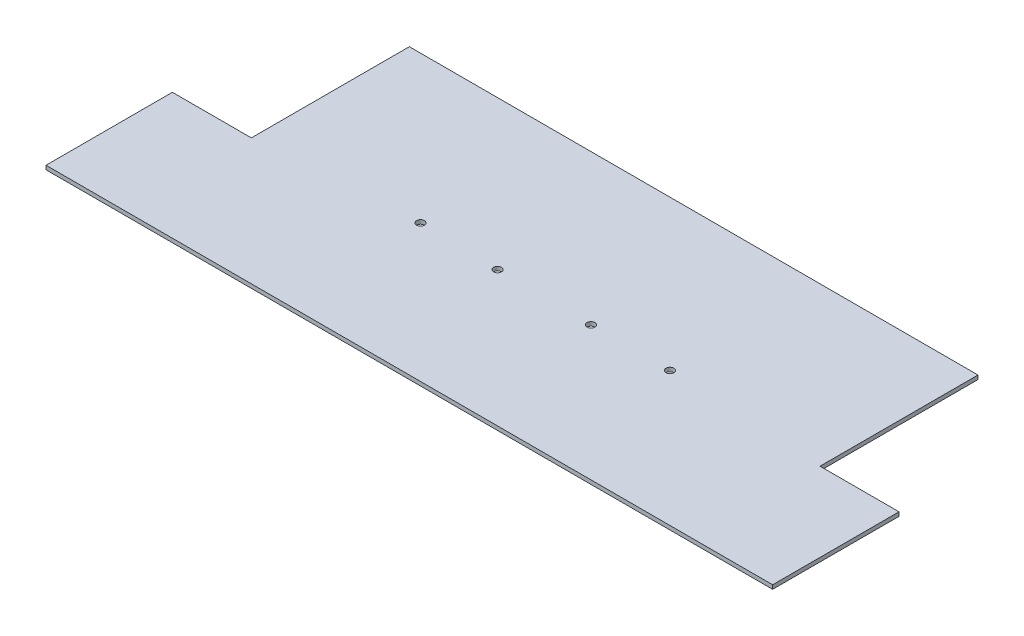
ISO-10303-21;
HEADER;
FILE_DESCRIPTION(('STEP AP214'),'2;1');
FILE_NAME('part.step','',(''),(''),'','','');
FILE_SCHEMA(('AUTOMOTIVE_DESIGN { 1 0 10303 214 1 1 1 1 }'));
ENDSEC;
DATA;
#1=APPLICATION_CONTEXT('core data for automotive mechanical design processes');
#2=APPLICATION_PROTOCOL_DEFINITION('international standard','automotive_design',2000,#1);
#3=PRODUCT_CONTEXT('',#1,'mechanical');
#4=PRODUCT('Part','Part','',(#3));
#5=PRODUCT_RELATED_PRODUCT_CATEGORY('part','',(#4));
#6=PRODUCT_DEFINITION_FORMATION('','',#4);
#7=PRODUCT_DEFINITION_CONTEXT('part definition',#1,'design');
#8=PRODUCT_DEFINITION('design','',#6,#7);
#9=PRODUCT_DEFINITION_SHAPE('','',#8);
#10=(LENGTH_UNIT() NAMED_UNIT(*) SI_UNIT(.MILLI.,.METRE.));
#11=(NAMED_UNIT(*) PLANE_ANGLE_UNIT() SI_UNIT($,.RADIAN.));
#12=(NAMED_UNIT(*) SI_UNIT($,.STERADIAN.) SOLID_ANGLE_UNIT());
#13=UNCERTAINTY_MEASURE_WITH_UNIT(LENGTH_MEASURE(1.E-05),#10,'distance_accuracy_value','');
#14=(GEOMETRIC_REPRESENTATION_CONTEXT(3) GLOBAL_UNCERTAINTY_ASSIGNED_CONTEXT((#13)) GLOBAL_UNIT_ASSIGNED_CONTEXT((#10,
#11,#12)) REPRESENTATION_CONTEXT('',''));
#15=CARTESIAN_POINT('',(0.,0.,0.));
#16=DIRECTION('',(0.,0.,1.));
#17=DIRECTION('',(1.,0.,0.));
#18=AXIS2_PLACEMENT_3D('',#15,#16,#17);
#19=CARTESIAN_POINT('',(0.,-28.575,-114.3));
#20=DIRECTION('',(0.,0.,-1.));
#21=DIRECTION('',(-1.,0.,0.));
#22=AXIS2_PLACEMENT_3D('',#19,#20,#21);
#23=PLANE('',#22);
#24=DIRECTION('',(-1.,0.,0.));
#25=VECTOR('',#24,1.);
#26=CARTESIAN_POINT('',(0.,-25.4,-114.3));
#27=LINE('',#26,#25);
#28=CARTESIAN_POINT('',(292.1,-25.4,-114.3));
#29=VERTEX_POINT('',#28);
#30=CARTESIAN_POINT('',(-292.100000000007,-25.4,-114.3));
#31=VERTEX_POINT('',#30);
#32=EDGE_CURVE('E134',#29,#31,#27,.T.);
#33=ORIENTED_EDGE('',*,*,#32,.T.);
#34=DIRECTION('',(0.,1.,0.));
#35=VECTOR('',#34,1.);
#36=CARTESIAN_POINT('',(-292.100000000007,-28.575,-114.3));
#37=LINE('',#36,#35);
#38=CARTESIAN_POINT('',(-292.100000000007,-28.575,-114.3));
#39=VERTEX_POINT('',#38);
#40=EDGE_CURVE('E11',#39,#31,#37,.T.);
#41=ORIENTED_EDGE('',*,*,#40,.F.);
#42=DIRECTION('',(-1.,0.,0.));
#43=VECTOR('',#42,1.);
#44=CARTESIAN_POINT('',(0.,-28.575,-114.3));
#45=LINE('',#44,#43);
#46=CARTESIAN_POINT('',(292.1,-28.575,-114.3));
#47=VERTEX_POINT('',#46);
#48=EDGE_CURVE('E153',#47,#39,#45,.T.);
#49=ORIENTED_EDGE('',*,*,#48,.F.);
#50=DIRECTION('',(0.,1.,0.));
#51=VECTOR('',#50,1.);
#52=CARTESIAN_POINT('',(292.1,-28.575,-114.3));
#53=LINE('',#52,#51);
#54=EDGE_CURVE('E54',#47,#29,#53,.T.);
#55=ORIENTED_EDGE('',*,*,#54,.T.);
#56=EDGE_LOOP('',(#33,#41,#49,#55));
#57=FACE_BOUND('',#56,.T.);
#58=ADVANCED_FACE('F38',(#57),#23,.F.);
#59=CARTESIAN_POINT('',(-292.100000000007,-28.575,0.));
#60=DIRECTION('',(1.,0.,0.));
#61=DIRECTION('',(0.,0.,-1.));
#62=AXIS2_PLACEMENT_3D('',#59,#60,#61);
#63=PLANE('',#62);
#64=DIRECTION('',(0.,0.,-1.));
#65=VECTOR('',#64,1.);
#66=CARTESIAN_POINT('',(-292.100000000007,-25.4,0.));
#67=LINE('',#66,#65);
#68=CARTESIAN_POINT('',(-292.100000000007,-25.4,-215.9));
#69=VERTEX_POINT('',#68);
#70=EDGE_CURVE('E136',#31,#69,#67,.T.);
#71=ORIENTED_EDGE('',*,*,#70,.T.);
#72=DIRECTION('',(0.,1.,0.));
#73=VECTOR('',#72,1.);
#74=CARTESIAN_POINT('',(-292.100000000007,-28.575,-215.9));
#75=LINE('',#74,#73);
#76=CARTESIAN_POINT('',(-292.100000000007,-28.575,-215.9));
#77=VERTEX_POINT('',#76);
#78=EDGE_CURVE('E46',#77,#69,#75,.T.);
#79=ORIENTED_EDGE('',*,*,#78,.F.);
#80=DIRECTION('',(0.,0.,-1.));
#81=VECTOR('',#80,1.);
#82=CARTESIAN_POINT('',(-292.100000000007,-28.575,0.));
#83=LINE('',#82,#81);
#84=EDGE_CURVE('E92',#39,#77,#83,.T.);
#85=ORIENTED_EDGE('',*,*,#84,.F.);
#86=ORIENTED_EDGE('',*,*,#40,.T.);
#87=EDGE_LOOP('',(#71,#79,#85,#86));
#88=FACE_BOUND('',#87,.T.);
#89=ADVANCED_FACE('F232',(#88),#63,.F.);
#90=CARTESIAN_POINT('',(0.,-28.575,-215.9));
#91=DIRECTION('',(0.,0.,1.));
#92=DIRECTION('',(1.,0.,0.));
#93=AXIS2_PLACEMENT_3D('',#90,#91,#92);
#94=PLANE('',#93);
#95=DIRECTION('',(1.,0.,0.));
#96=VECTOR('',#95,1.);
#97=CARTESIAN_POINT('',(0.,-25.4,-215.9));
#98=LINE('',#97,#96);
#99=CARTESIAN_POINT('',(-228.600000000007,-25.4,-215.9));
#100=VERTEX_POINT('',#99);
#101=EDGE_CURVE('E139',#69,#100,#98,.T.);
#102=ORIENTED_EDGE('',*,*,#101,.T.);
#103=DIRECTION('',(0.,1.,0.));
#104=VECTOR('',#103,1.);
#105=CARTESIAN_POINT('',(-228.600000000007,-28.575,-215.9));
#106=LINE('',#105,#104);
#107=CARTESIAN_POINT('',(-228.600000000007,-28.575,-215.9));
#108=VERTEX_POINT('',#107);
#109=EDGE_CURVE('E159',#108,#100,#106,.T.);
#110=ORIENTED_EDGE('',*,*,#109,.F.);
#111=DIRECTION('',(1.,0.,0.));
#112=VECTOR('',#111,1.);
#113=CARTESIAN_POINT('',(0.,-28.575,-215.9));
#114=LINE('',#113,#112);
#115=EDGE_CURVE('E167',#77,#108,#114,.T.);
#116=ORIENTED_EDGE('',*,*,#115,.F.);
#117=ORIENTED_EDGE('',*,*,#78,.T.);
#118=EDGE_LOOP('',(#102,#110,#116,#117));
#119=FACE_BOUND('',#118,.T.);
#120=ADVANCED_FACE('F165',(#119),#94,.F.);
#121=CARTESIAN_POINT('',(-228.600000000007,-28.575,0.));
#122=DIRECTION('',(1.,0.,0.));
#123=DIRECTION('',(0.,0.,-1.));
#124=AXIS2_PLACEMENT_3D('',#121,#122,#123);
#125=PLANE('',#124);
#126=DIRECTION('',(0.,0.,-1.));
#127=VECTOR('',#126,1.);
#128=CARTESIAN_POINT('',(-228.600000000007,-25.4,0.));
#129=LINE('',#128,#127);
#130=CARTESIAN_POINT('',(-228.600000000007,-25.4,-342.9));
#131=VERTEX_POINT('',#130);
#132=EDGE_CURVE('E141',#100,#131,#129,.T.);
#133=ORIENTED_EDGE('',*,*,#132,.T.);
#134=DIRECTION('',(0.,1.,0.));
#135=VECTOR('',#134,1.);
#136=CARTESIAN_POINT('',(-228.600000000007,-28.575,-342.9));
#137=LINE('',#136,#135);
#138=CARTESIAN_POINT('',(-228.600000000007,-28.575,-342.9));
#139=VERTEX_POINT('',#138);
#140=EDGE_CURVE('E157',#139,#131,#137,.T.);
#141=ORIENTED_EDGE('',*,*,#140,.F.);
#142=DIRECTION('',(0.,0.,-1.));
#143=VECTOR('',#142,1.);
#144=CARTESIAN_POINT('',(-228.600000000007,-28.575,0.));
#145=LINE('',#144,#143);
#146=EDGE_CURVE('E176',#108,#139,#145,.T.);
#147=ORIENTED_EDGE('',*,*,#146,.F.);
#148=ORIENTED_EDGE('',*,*,#109,.T.);
#149=EDGE_LOOP('',(#133,#141,#147,#148));
#150=FACE_BOUND('',#149,.T.);
#151=ADVANCED_FACE('F174',(#150),#125,.F.);
#152=CARTESIAN_POINT('',(0.,-28.575,-342.9));
#153=DIRECTION('',(0.,0.,-1.));
#154=DIRECTION('',(-1.,0.,0.));
#155=AXIS2_PLACEMENT_3D('',#152,#153,#154);
#156=PLANE('',#155);
#157=DIRECTION('',(-1.,0.,0.));
#158=VECTOR('',#157,1.);
#159=CARTESIAN_POINT('',(0.,-25.4,-342.9));
#160=LINE('',#159,#158);
#161=CARTESIAN_POINT('',(228.600000000001,-25.4,-342.9));
#162=VERTEX_POINT('',#161);
#163=EDGE_CURVE('E144',#162,#131,#160,.T.);
#164=ORIENTED_EDGE('',*,*,#163,.F.);
#165=DIRECTION('',(0.,1.,0.));
#166=VECTOR('',#165,1.);
#167=CARTESIAN_POINT('',(228.600000000001,-28.575,-342.9));
#168=LINE('',#167,#166);
#169=CARTESIAN_POINT('',(228.600000000001,-28.575,-342.9));
#170=VERTEX_POINT('',#169);
#171=EDGE_CURVE('E117',#170,#162,#168,.T.);
#172=ORIENTED_EDGE('',*,*,#171,.F.);
#173=DIRECTION('',(-1.,0.,0.));
#174=VECTOR('',#173,1.);
#175=CARTESIAN_POINT('',(0.,-28.575,-342.9));
#176=LINE('',#175,#174);
#177=EDGE_CURVE('E126',#170,#139,#176,.T.);
#178=ORIENTED_EDGE('',*,*,#177,.T.);
#179=ORIENTED_EDGE('',*,*,#140,.T.);
#180=EDGE_LOOP('',(#164,#172,#178,#179));
#181=FACE_BOUND('',#180,.T.);
#182=ADVANCED_FACE('F250',(#181),#156,.T.);
#183=CARTESIAN_POINT('',(228.600000000001,-28.575,0.));
#184=DIRECTION('',(1.,0.,0.));
#185=DIRECTION('',(0.,0.,-1.));
#186=AXIS2_PLACEMENT_3D('',#183,#184,#185);
#187=PLANE('',#186);
#188=DIRECTION('',(0.,0.,-1.));
#189=VECTOR('',#188,1.);
#190=CARTESIAN_POINT('',(228.600000000001,-25.4,0.));
#191=LINE('',#190,#189);
#192=CARTESIAN_POINT('',(228.600000000001,-25.4,-215.9));
#193=VERTEX_POINT('',#192);
#194=EDGE_CURVE('E113',#193,#162,#191,.T.);
#195=ORIENTED_EDGE('',*,*,#194,.F.);
#196=DIRECTION('',(0.,1.,0.));
#197=VECTOR('',#196,1.);
#198=CARTESIAN_POINT('',(228.600000000001,-28.575,-215.9));
#199=LINE('',#198,#197);
#200=CARTESIAN_POINT('',(228.600000000001,-28.575,-215.9));
#201=VERTEX_POINT('',#200);
#202=EDGE_CURVE('E108',#201,#193,#199,.T.);
#203=ORIENTED_EDGE('',*,*,#202,.F.);
#204=DIRECTION('',(0.,0.,-1.));
#205=VECTOR('',#204,1.);
#206=CARTESIAN_POINT('',(228.600000000001,-28.575,0.));
#207=LINE('',#206,#205);
#208=EDGE_CURVE('E111',#201,#170,#207,.T.);
#209=ORIENTED_EDGE('',*,*,#208,.T.);
#210=ORIENTED_EDGE('',*,*,#171,.T.);
#211=EDGE_LOOP('',(#195,#203,#209,#210));
#212=FACE_BOUND('',#211,.T.);
#213=ADVANCED_FACE('F110',(#212),#187,.T.);
#214=CARTESIAN_POINT('',(0.,-28.575,-215.9));
#215=DIRECTION('',(0.,0.,-1.));
#216=DIRECTION('',(-1.,0.,0.));
#217=AXIS2_PLACEMENT_3D('',#214,#215,#216);
#218=PLANE('',#217);
#219=DIRECTION('',(-1.,0.,0.));
#220=VECTOR('',#219,1.);
#221=CARTESIAN_POINT('',(0.,-25.4,-215.9));
#222=LINE('',#221,#220);
#223=CARTESIAN_POINT('',(292.100000000001,-25.4,-215.9));
#224=VERTEX_POINT('',#223);
#225=EDGE_CURVE('E148',#224,#193,#222,.T.);
#226=ORIENTED_EDGE('',*,*,#225,.F.);
#227=DIRECTION('',(0.,1.,0.));
#228=VECTOR('',#227,1.);
#229=CARTESIAN_POINT('',(292.100000000001,-28.575,-215.9));
#230=LINE('',#229,#228);
#231=CARTESIAN_POINT('',(292.100000000001,-28.575,-215.9));
#232=VERTEX_POINT('',#231);
#233=EDGE_CURVE('E80',#232,#224,#230,.T.);
#234=ORIENTED_EDGE('',*,*,#233,.F.);
#235=DIRECTION('',(-1.,0.,0.));
#236=VECTOR('',#235,1.);
#237=CARTESIAN_POINT('',(0.,-28.575,-215.9));
#238=LINE('',#237,#236);
#239=EDGE_CURVE('E124',#232,#201,#238,.T.);
#240=ORIENTED_EDGE('',*,*,#239,.T.);
#241=ORIENTED_EDGE('',*,*,#202,.T.);
#242=EDGE_LOOP('',(#226,#234,#240,#241));
#243=FACE_BOUND('',#242,.T.);
#244=ADVANCED_FACE('F128',(#243),#218,.T.);
#245=CARTESIAN_POINT('',(292.1,-28.575,0.));
#246=DIRECTION('',(1.,0.,0.));
#247=DIRECTION('',(0.,0.,-1.));
#248=AXIS2_PLACEMENT_3D('',#245,#246,#247);
#249=PLANE('',#248);
#250=DIRECTION('',(0.,0.,-1.));
#251=VECTOR('',#250,1.);
#252=CARTESIAN_POINT('',(292.1,-25.4,0.));
#253=LINE('',#252,#251);
#254=EDGE_CURVE('E150',#29,#224,#253,.T.);
#255=ORIENTED_EDGE('',*,*,#254,.F.);
#256=ORIENTED_EDGE('',*,*,#54,.F.);
#257=DIRECTION('',(0.,0.,-1.));
#258=VECTOR('',#257,1.);
#259=CARTESIAN_POINT('',(292.1,-28.575,0.));
#260=LINE('',#259,#258);
#261=EDGE_CURVE('E129',#47,#232,#260,.T.);
#262=ORIENTED_EDGE('',*,*,#261,.T.);
#263=ORIENTED_EDGE('',*,*,#233,.T.);
#264=EDGE_LOOP('',(#255,#256,#262,#263));
#265=FACE_BOUND('',#264,.T.);
#266=ADVANCED_FACE('F237',(#265),#249,.T.);
#267=CARTESIAN_POINT('',(0.,-28.575,0.));
#268=DIRECTION('',(0.,-1.,0.));
#269=DIRECTION('',(0.,0.,-1.));
#270=AXIS2_PLACEMENT_3D('',#267,#268,#269);
#271=PLANE('',#270);
#272=CARTESIAN_POINT('',(-37.9350646933135,-28.575,-223.170719819828));
#273=DIRECTION('',(0.,1.,0.));
#274=DIRECTION('',(0.,0.,1.));
#275=AXIS2_PLACEMENT_3D('',#272,#273,#274);
#276=CIRCLE('',#275,3.17499999999999);
#277=CARTESIAN_POINT('',(-37.9350646933135,-28.575,-219.995719819828));
#278=VERTEX_POINT('',#277);
#279=EDGE_CURVE('E199',#278,#278,#276,.T.);
#280=ORIENTED_EDGE('',*,*,#279,.T.);
#281=EDGE_LOOP('',(#280));
#282=FACE_BOUND('',#281,.T.);
#283=CARTESIAN_POINT('',(-101.416445228806,-28.575,-224.708356097011));
#284=DIRECTION('',(0.,1.,0.));
#285=DIRECTION('',(0.,0.,1.));
#286=AXIS2_PLACEMENT_3D('',#283,#284,#285);
#287=CIRCLE('',#286,3.175);
#288=CARTESIAN_POINT('',(-101.416445228806,-28.575,-221.533356097011));
#289=VERTEX_POINT('',#288);
#290=EDGE_CURVE('E193',#289,#289,#287,.T.);
#291=ORIENTED_EDGE('',*,*,#290,.T.);
#292=EDGE_LOOP('',(#291));
#293=FACE_BOUND('',#292,.T.);
#294=CARTESIAN_POINT('',(38.0999999997969,-28.575,-222.249999999986));
#295=DIRECTION('',(0.,1.,0.));
#296=DIRECTION('',(0.,0.,1.));
#297=AXIS2_PLACEMENT_3D('',#294,#295,#296);
#298=CIRCLE('',#297,3.17499999999999);
#299=CARTESIAN_POINT('',(38.0999999997969,-28.575,-219.074999999986));
#300=VERTEX_POINT('',#299);
#301=EDGE_CURVE('E187',#300,#300,#298,.T.);
#302=ORIENTED_EDGE('',*,*,#301,.T.);
#303=EDGE_LOOP('',(#302));
#304=FACE_BOUND('',#303,.T.);
#305=CARTESIAN_POINT('',(101.599999999898,-28.575,-222.249999999986));
#306=DIRECTION('',(0.,1.,0.));
#307=DIRECTION('',(0.,0.,1.));
#308=AXIS2_PLACEMENT_3D('',#305,#306,#307);
#309=CIRCLE('',#308,3.175);
#310=CARTESIAN_POINT('',(101.599999999898,-28.575,-219.074999999986));
#311=VERTEX_POINT('',#310);
#312=EDGE_CURVE('E137',#311,#311,#309,.T.);
#313=ORIENTED_EDGE('',*,*,#312,.T.);
#314=EDGE_LOOP('',(#313));
#315=FACE_BOUND('',#314,.T.);
#316=ORIENTED_EDGE('',*,*,#48,.T.);
#317=ORIENTED_EDGE('',*,*,#84,.T.);
#318=ORIENTED_EDGE('',*,*,#115,.T.);
#319=ORIENTED_EDGE('',*,*,#146,.T.);
#320=ORIENTED_EDGE('',*,*,#177,.F.);
#321=ORIENTED_EDGE('',*,*,#208,.F.);
#322=ORIENTED_EDGE('',*,*,#239,.F.);
#323=ORIENTED_EDGE('',*,*,#261,.F.);
#324=EDGE_LOOP('',(#316,#317,#318,#319,#320,#321,#322,#323));
#325=FACE_BOUND('',#324,.T.);
#326=ADVANCED_FACE('F122',(#282,#293,#304,#315,#325),#271,.T.);
#327=CARTESIAN_POINT('',(0.,-25.4,0.));
#328=DIRECTION('',(0.,-1.,0.));
#329=DIRECTION('',(0.,0.,-1.));
#330=AXIS2_PLACEMENT_3D('',#327,#328,#329);
#331=PLANE('',#330);
#332=CARTESIAN_POINT('',(-37.9350646933135,-25.4,-223.170719819828));
#333=DIRECTION('',(0.,1.,0.));
#334=DIRECTION('',(0.,0.,1.));
#335=AXIS2_PLACEMENT_3D('',#332,#333,#334);
#336=CIRCLE('',#335,3.17499999999998);
#337=CARTESIAN_POINT('',(-37.9350646933135,-25.4,-219.995719819828));
#338=VERTEX_POINT('',#337);
#339=EDGE_CURVE('E202',#338,#338,#336,.T.);
#340=ORIENTED_EDGE('',*,*,#339,.F.);
#341=EDGE_LOOP('',(#340));
#342=FACE_BOUND('',#341,.T.);
#343=CARTESIAN_POINT('',(-101.416445228806,-25.4,-224.708356097011));
#344=DIRECTION('',(0.,1.,0.));
#345=DIRECTION('',(0.,0.,1.));
#346=AXIS2_PLACEMENT_3D('',#343,#344,#345);
#347=CIRCLE('',#346,3.17499999999998);
#348=CARTESIAN_POINT('',(-101.416445228806,-25.4,-221.533356097011));
#349=VERTEX_POINT('',#348);
#350=EDGE_CURVE('E196',#349,#349,#347,.T.);
#351=ORIENTED_EDGE('',*,*,#350,.F.);
#352=EDGE_LOOP('',(#351));
#353=FACE_BOUND('',#352,.T.);
#354=CARTESIAN_POINT('',(38.0999999997969,-25.4,-222.249999999986));
#355=DIRECTION('',(0.,1.,0.));
#356=DIRECTION('',(0.,0.,1.));
#357=AXIS2_PLACEMENT_3D('',#354,#355,#356);
#358=CIRCLE('',#357,3.17499999999998);
#359=CARTESIAN_POINT('',(38.0999999997969,-25.4,-219.074999999986));
#360=VERTEX_POINT('',#359);
#361=EDGE_CURVE('E190',#360,#360,#358,.T.);
#362=ORIENTED_EDGE('',*,*,#361,.F.);
#363=EDGE_LOOP('',(#362));
#364=FACE_BOUND('',#363,.T.);
#365=CARTESIAN_POINT('',(101.599999999898,-25.4,-222.249999999986));
#366=DIRECTION('',(0.,1.,0.));
#367=DIRECTION('',(0.,0.,1.));
#368=AXIS2_PLACEMENT_3D('',#365,#366,#367);
#369=CIRCLE('',#368,3.17499999999998);
#370=CARTESIAN_POINT('',(101.599999999898,-25.4,-219.074999999986));
#371=VERTEX_POINT('',#370);
#372=EDGE_CURVE('E184',#371,#371,#369,.T.);
#373=ORIENTED_EDGE('',*,*,#372,.F.);
#374=EDGE_LOOP('',(#373));
#375=FACE_BOUND('',#374,.T.);
#376=ORIENTED_EDGE('',*,*,#32,.F.);
#377=ORIENTED_EDGE('',*,*,#254,.T.);
#378=ORIENTED_EDGE('',*,*,#225,.T.);
#379=ORIENTED_EDGE('',*,*,#194,.T.);
#380=ORIENTED_EDGE('',*,*,#163,.T.);
#381=ORIENTED_EDGE('',*,*,#132,.F.);
#382=ORIENTED_EDGE('',*,*,#101,.F.);
#383=ORIENTED_EDGE('',*,*,#70,.F.);
#384=EDGE_LOOP('',(#376,#377,#378,#379,#380,#381,#382,#383));
#385=FACE_BOUND('',#384,.T.);
#386=ADVANCED_FACE('F170',(#342,#353,#364,#375,#385),#331,.F.);
#387=CARTESIAN_POINT('',(101.599999999898,-25.4,-222.249999999986));
#388=DIRECTION('',(0.,1.,0.));
#389=DIRECTION('',(0.,0.,1.));
#390=AXIS2_PLACEMENT_3D('',#387,#388,#389);
#391=CYLINDRICAL_SURFACE('',#390,3.17499999999999);
#392=ORIENTED_EDGE('',*,*,#312,.F.);
#393=EDGE_LOOP('',(#392));
#394=FACE_BOUND('',#393,.T.);
#395=ORIENTED_EDGE('',*,*,#372,.T.);
#396=EDGE_LOOP('',(#395));
#397=FACE_BOUND('',#396,.T.);
#398=ADVANCED_FACE('F210',(#394,#397),#391,.F.);
#399=CARTESIAN_POINT('',(38.0999999997969,-25.4,-222.249999999986));
#400=DIRECTION('',(0.,1.,0.));
#401=DIRECTION('',(0.,0.,1.));
#402=AXIS2_PLACEMENT_3D('',#399,#400,#401);
#403=CYLINDRICAL_SURFACE('',#402,3.17499999999999);
#404=ORIENTED_EDGE('',*,*,#301,.F.);
#405=EDGE_LOOP('',(#404));
#406=FACE_BOUND('',#405,.T.);
#407=ORIENTED_EDGE('',*,*,#361,.T.);
#408=EDGE_LOOP('',(#407));
#409=FACE_BOUND('',#408,.T.);
#410=ADVANCED_FACE('F219',(#406,#409),#403,.F.);
#411=CARTESIAN_POINT('',(-101.416445228806,-25.4,-224.708356097011));
#412=DIRECTION('',(0.,1.,0.));
#413=DIRECTION('',(0.,0.,1.));
#414=AXIS2_PLACEMENT_3D('',#411,#412,#413);
#415=CYLINDRICAL_SURFACE('',#414,3.17499999999999);
#416=ORIENTED_EDGE('',*,*,#290,.F.);
#417=EDGE_LOOP('',(#416));
#418=FACE_BOUND('',#417,.T.);
#419=ORIENTED_EDGE('',*,*,#350,.T.);
#420=EDGE_LOOP('',(#419));
#421=FACE_BOUND('',#420,.T.);
#422=ADVANCED_FACE('F226',(#418,#421),#415,.F.);
#423=CARTESIAN_POINT('',(-37.9350646933135,-25.4,-223.170719819828));
#424=DIRECTION('',(0.,1.,0.));
#425=DIRECTION('',(0.,0.,1.));
#426=AXIS2_PLACEMENT_3D('',#423,#424,#425);
#427=CYLINDRICAL_SURFACE('',#426,3.17499999999999);
#428=ORIENTED_EDGE('',*,*,#279,.F.);
#429=EDGE_LOOP('',(#428));
#430=FACE_BOUND('',#429,.T.);
#431=ORIENTED_EDGE('',*,*,#339,.T.);
#432=EDGE_LOOP('',(#431));
#433=FACE_BOUND('',#432,.T.);
#434=ADVANCED_FACE('F206',(#430,#433),#427,.F.);
#435=CLOSED_SHELL('',(#58,#89,#120,#151,#182,#213,#244,#266,#326,#386,#398,#410,#422,#434));
#436=MANIFOLD_SOLID_BREP('B2',#435);
#437=ADVANCED_BREP_SHAPE_REPRESENTATION('',(#18,#436),#14);
#438=SHAPE_DEFINITION_REPRESENTATION(#9,#437);
ENDSEC;
END-ISO-10303-21;
